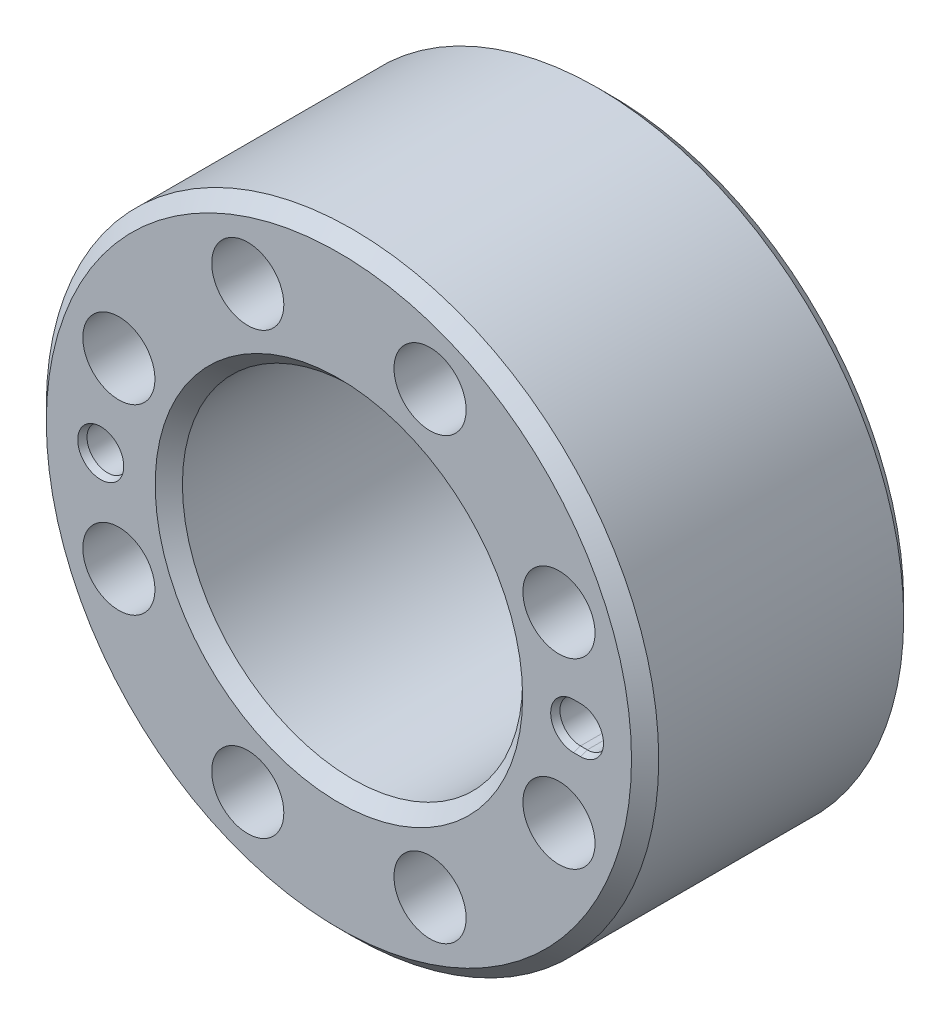
ISO-10303-21;
HEADER;
FILE_DESCRIPTION(('STEP AP214'),'2;1');
FILE_NAME('part.step','',(''),(''),'','','');
FILE_SCHEMA(('AUTOMOTIVE_DESIGN { 1 0 10303 214 1 1 1 1 }'));
ENDSEC;
DATA;
#1=APPLICATION_CONTEXT('core data for automotive mechanical design processes');
#2=APPLICATION_PROTOCOL_DEFINITION('international standard','automotive_design',2000,#1);
#3=PRODUCT_CONTEXT('',#1,'mechanical');
#4=PRODUCT('Part','Part','',(#3));
#5=PRODUCT_RELATED_PRODUCT_CATEGORY('part','',(#4));
#6=PRODUCT_DEFINITION_FORMATION('','',#4);
#7=PRODUCT_DEFINITION_CONTEXT('part definition',#1,'design');
#8=PRODUCT_DEFINITION('design','',#6,#7);
#9=PRODUCT_DEFINITION_SHAPE('','',#8);
#10=(LENGTH_UNIT() NAMED_UNIT(*) SI_UNIT(.MILLI.,.METRE.));
#11=(NAMED_UNIT(*) PLANE_ANGLE_UNIT() SI_UNIT($,.RADIAN.));
#12=(NAMED_UNIT(*) SI_UNIT($,.STERADIAN.) SOLID_ANGLE_UNIT());
#13=UNCERTAINTY_MEASURE_WITH_UNIT(LENGTH_MEASURE(1.E-05),#10,'distance_accuracy_value','');
#14=(GEOMETRIC_REPRESENTATION_CONTEXT(3) GLOBAL_UNCERTAINTY_ASSIGNED_CONTEXT((#13)) GLOBAL_UNIT_ASSIGNED_CONTEXT((#10,
#11,#12)) REPRESENTATION_CONTEXT('',''));
#15=CARTESIAN_POINT('',(0.,0.,0.));
#16=DIRECTION('',(0.,0.,1.));
#17=DIRECTION('',(1.,0.,0.));
#18=AXIS2_PLACEMENT_3D('',#15,#16,#17);
#19=CARTESIAN_POINT('',(0.,0.,10.));
#20=DIRECTION('',(0.,0.,1.));
#21=DIRECTION('',(1.,0.,0.));
#22=AXIS2_PLACEMENT_3D('',#19,#20,#21);
#23=PLANE('',#22);
#24=DIRECTION('',(-1.,0.,0.));
#25=VECTOR('',#24,1.);
#26=CARTESIAN_POINT('',(17.25,-1.68998511713311,10.));
#27=LINE('',#26,#25);
#28=CARTESIAN_POINT('',(17.75,-1.68998511713311,10.));
#29=VERTEX_POINT('',#28);
#30=CARTESIAN_POINT('',(17.25,-1.68998511713311,10.));
#31=VERTEX_POINT('',#30);
#32=EDGE_CURVE('E245',#29,#31,#27,.T.);
#33=ORIENTED_EDGE('',*,*,#32,.T.);
#34=CARTESIAN_POINT('',(17.25,0.,10.));
#35=DIRECTION('',(0.,0.,1.));
#36=DIRECTION('',(1.,0.,0.));
#37=AXIS2_PLACEMENT_3D('',#34,#35,#36);
#38=CIRCLE('',#37,1.68998511713311);
#39=CARTESIAN_POINT('',(17.25,1.68998511713311,10.));
#40=VERTEX_POINT('',#39);
#41=EDGE_CURVE('E247',#31,#40,#38,.F.);
#42=ORIENTED_EDGE('',*,*,#41,.T.);
#43=DIRECTION('',(1.,0.,0.));
#44=VECTOR('',#43,1.);
#45=CARTESIAN_POINT('',(17.75,1.68998511713311,10.));
#46=LINE('',#45,#44);
#47=CARTESIAN_POINT('',(17.75,1.68998511713311,10.));
#48=VERTEX_POINT('',#47);
#49=EDGE_CURVE('E243',#40,#48,#46,.T.);
#50=ORIENTED_EDGE('',*,*,#49,.T.);
#51=CARTESIAN_POINT('',(17.75,0.,10.));
#52=DIRECTION('',(0.,0.,1.));
#53=DIRECTION('',(1.,0.,0.));
#54=AXIS2_PLACEMENT_3D('',#51,#52,#53);
#55=CIRCLE('',#54,1.68998511713311);
#56=EDGE_CURVE('E241',#48,#29,#55,.F.);
#57=ORIENTED_EDGE('',*,*,#56,.T.);
#58=EDGE_LOOP('',(#33,#42,#50,#57));
#59=FACE_BOUND('',#58,.T.);
#60=CARTESIAN_POINT('',(-17.5,0.,10.));
#61=DIRECTION('',(0.,0.,1.));
#62=DIRECTION('',(1.,0.,0.));
#63=AXIS2_PLACEMENT_3D('',#60,#61,#62);
#64=CIRCLE('',#63,1.68998511713309);
#65=CARTESIAN_POINT('',(-15.8100148828669,0.,10.));
#66=VERTEX_POINT('',#65);
#67=EDGE_CURVE('E238',#66,#66,#64,.F.);
#68=ORIENTED_EDGE('',*,*,#67,.T.);
#69=EDGE_LOOP('',(#68));
#70=FACE_BOUND('',#69,.T.);
#71=CARTESIAN_POINT('',(0.,0.,10.));
#72=DIRECTION('',(0.,0.,1.));
#73=DIRECTION('',(1.,0.,0.));
#74=AXIS2_PLACEMENT_3D('',#71,#72,#73);
#75=CIRCLE('',#74,13.5);
#76=CARTESIAN_POINT('',(13.5,0.,10.));
#77=VERTEX_POINT('',#76);
#78=EDGE_CURVE('E216',#77,#77,#75,.F.);
#79=ORIENTED_EDGE('',*,*,#78,.T.);
#80=EDGE_LOOP('',(#79));
#81=FACE_BOUND('',#80,.T.);
#82=CARTESIAN_POINT('',(0.,0.,10.));
#83=DIRECTION('',(0.,0.,1.));
#84=DIRECTION('',(1.,0.,0.));
#85=AXIS2_PLACEMENT_3D('',#82,#83,#84);
#86=CIRCLE('',#85,21.5);
#87=CARTESIAN_POINT('',(21.5,0.,10.));
#88=VERTEX_POINT('',#87);
#89=EDGE_CURVE('E213',#88,#88,#86,.T.);
#90=ORIENTED_EDGE('',*,*,#89,.T.);
#91=EDGE_LOOP('',(#90));
#92=FACE_BOUND('',#91,.T.);
#93=CARTESIAN_POINT('',(6.69696006638907,-16.1678918189475,10.));
#94=DIRECTION('',(0.,0.,1.));
#95=DIRECTION('',(1.,0.,0.));
#96=AXIS2_PLACEMENT_3D('',#93,#94,#95);
#97=CIRCLE('',#96,2.65);
#98=CARTESIAN_POINT('',(9.34696006638907,-16.1678918189475,10.));
#99=VERTEX_POINT('',#98);
#100=EDGE_CURVE('E153',#99,#99,#97,.T.);
#101=ORIENTED_EDGE('',*,*,#100,.F.);
#102=EDGE_LOOP('',(#101));
#103=FACE_BOUND('',#102,.T.);
#104=CARTESIAN_POINT('',(16.1678918189475,-6.69696006638907,10.));
#105=DIRECTION('',(0.,0.,1.));
#106=DIRECTION('',(1.,0.,0.));
#107=AXIS2_PLACEMENT_3D('',#104,#105,#106);
#108=CIRCLE('',#107,2.65);
#109=CARTESIAN_POINT('',(18.8178918189475,-6.69696006638907,10.));
#110=VERTEX_POINT('',#109);
#111=EDGE_CURVE('E159',#110,#110,#108,.T.);
#112=ORIENTED_EDGE('',*,*,#111,.F.);
#113=EDGE_LOOP('',(#112));
#114=FACE_BOUND('',#113,.T.);
#115=CARTESIAN_POINT('',(16.1678918189475,6.69696006638907,10.));
#116=DIRECTION('',(0.,0.,1.));
#117=DIRECTION('',(1.,0.,0.));
#118=AXIS2_PLACEMENT_3D('',#115,#116,#117);
#119=CIRCLE('',#118,2.65);
#120=CARTESIAN_POINT('',(18.8178918189475,6.69696006638907,10.));
#121=VERTEX_POINT('',#120);
#122=EDGE_CURVE('E165',#121,#121,#119,.T.);
#123=ORIENTED_EDGE('',*,*,#122,.F.);
#124=EDGE_LOOP('',(#123));
#125=FACE_BOUND('',#124,.T.);
#126=CARTESIAN_POINT('',(6.69696006638908,16.1678918189475,10.));
#127=DIRECTION('',(0.,0.,1.));
#128=DIRECTION('',(1.,0.,0.));
#129=AXIS2_PLACEMENT_3D('',#126,#127,#128);
#130=CIRCLE('',#129,2.65);
#131=CARTESIAN_POINT('',(9.34696006638907,16.1678918189475,10.));
#132=VERTEX_POINT('',#131);
#133=EDGE_CURVE('E171',#132,#132,#130,.T.);
#134=ORIENTED_EDGE('',*,*,#133,.F.);
#135=EDGE_LOOP('',(#134));
#136=FACE_BOUND('',#135,.T.);
#137=CARTESIAN_POINT('',(-6.69696006638907,16.1678918189475,10.));
#138=DIRECTION('',(0.,0.,1.));
#139=DIRECTION('',(1.,0.,0.));
#140=AXIS2_PLACEMENT_3D('',#137,#138,#139);
#141=CIRCLE('',#140,2.65);
#142=CARTESIAN_POINT('',(-4.04696006638907,16.1678918189475,10.));
#143=VERTEX_POINT('',#142);
#144=EDGE_CURVE('E177',#143,#143,#141,.T.);
#145=ORIENTED_EDGE('',*,*,#144,.F.);
#146=EDGE_LOOP('',(#145));
#147=FACE_BOUND('',#146,.T.);
#148=CARTESIAN_POINT('',(-16.1678918189475,6.69696006638908,10.));
#149=DIRECTION('',(0.,0.,1.));
#150=DIRECTION('',(1.,0.,0.));
#151=AXIS2_PLACEMENT_3D('',#148,#149,#150);
#152=CIRCLE('',#151,2.65);
#153=CARTESIAN_POINT('',(-13.5178918189475,6.69696006638908,10.));
#154=VERTEX_POINT('',#153);
#155=EDGE_CURVE('E183',#154,#154,#152,.T.);
#156=ORIENTED_EDGE('',*,*,#155,.F.);
#157=EDGE_LOOP('',(#156));
#158=FACE_BOUND('',#157,.T.);
#159=CARTESIAN_POINT('',(-16.1678918189475,-6.69696006638907,10.));
#160=DIRECTION('',(0.,0.,1.));
#161=DIRECTION('',(1.,0.,0.));
#162=AXIS2_PLACEMENT_3D('',#159,#160,#161);
#163=CIRCLE('',#162,2.65);
#164=CARTESIAN_POINT('',(-13.5178918189475,-6.69696006638907,10.));
#165=VERTEX_POINT('',#164);
#166=EDGE_CURVE('E189',#165,#165,#163,.T.);
#167=ORIENTED_EDGE('',*,*,#166,.F.);
#168=EDGE_LOOP('',(#167));
#169=FACE_BOUND('',#168,.T.);
#170=CARTESIAN_POINT('',(-6.69696006638908,-16.1678918189475,10.));
#171=DIRECTION('',(0.,0.,1.));
#172=DIRECTION('',(1.,0.,0.));
#173=AXIS2_PLACEMENT_3D('',#170,#171,#172);
#174=CIRCLE('',#173,2.65);
#175=CARTESIAN_POINT('',(-4.04696006638908,-16.1678918189475,10.));
#176=VERTEX_POINT('',#175);
#177=EDGE_CURVE('E195',#176,#176,#174,.T.);
#178=ORIENTED_EDGE('',*,*,#177,.F.);
#179=EDGE_LOOP('',(#178));
#180=FACE_BOUND('',#179,.T.);
#181=ADVANCED_FACE('F44',(#59,#70,#81,#92,#103,#114,#125,#136,#147,#158,#169,#180),#23,.T.);
#182=CARTESIAN_POINT('',(0.,0.,-10.));
#183=DIRECTION('',(0.,0.,1.));
#184=DIRECTION('',(1.,0.,0.));
#185=AXIS2_PLACEMENT_3D('',#182,#183,#184);
#186=PLANE('',#185);
#187=CARTESIAN_POINT('',(17.5,0.,-10.));
#188=DIRECTION('',(0.,0.,1.));
#189=DIRECTION('',(1.,0.,0.));
#190=AXIS2_PLACEMENT_3D('',#187,#188,#189);
#191=CIRCLE('',#190,1.63198511713309);
#192=CARTESIAN_POINT('',(19.1319851171331,0.,-10.));
#193=VERTEX_POINT('',#192);
#194=EDGE_CURVE('E231',#193,#193,#191,.T.);
#195=ORIENTED_EDGE('',*,*,#194,.T.);
#196=EDGE_LOOP('',(#195));
#197=FACE_BOUND('',#196,.T.);
#198=CARTESIAN_POINT('',(-17.5,0.,-10.));
#199=DIRECTION('',(0.,0.,1.));
#200=DIRECTION('',(1.,0.,0.));
#201=AXIS2_PLACEMENT_3D('',#198,#199,#200);
#202=CIRCLE('',#201,1.63198511713309);
#203=CARTESIAN_POINT('',(-15.8680148828669,0.,-10.));
#204=VERTEX_POINT('',#203);
#205=EDGE_CURVE('E228',#204,#204,#202,.T.);
#206=ORIENTED_EDGE('',*,*,#205,.T.);
#207=EDGE_LOOP('',(#206));
#208=FACE_BOUND('',#207,.T.);
#209=CARTESIAN_POINT('',(0.,0.,-10.));
#210=DIRECTION('',(0.,0.,1.));
#211=DIRECTION('',(1.,0.,0.));
#212=AXIS2_PLACEMENT_3D('',#209,#210,#211);
#213=CIRCLE('',#212,13.5);
#214=CARTESIAN_POINT('',(13.5,0.,-10.));
#215=VERTEX_POINT('',#214);
#216=EDGE_CURVE('E204',#215,#215,#213,.T.);
#217=ORIENTED_EDGE('',*,*,#216,.T.);
#218=EDGE_LOOP('',(#217));
#219=FACE_BOUND('',#218,.T.);
#220=CARTESIAN_POINT('',(0.,0.,-10.));
#221=DIRECTION('',(0.,0.,1.));
#222=DIRECTION('',(1.,0.,0.));
#223=AXIS2_PLACEMENT_3D('',#220,#221,#222);
#224=CIRCLE('',#223,21.5);
#225=CARTESIAN_POINT('',(21.5,0.,-10.));
#226=VERTEX_POINT('',#225);
#227=EDGE_CURVE('E201',#226,#226,#224,.F.);
#228=ORIENTED_EDGE('',*,*,#227,.T.);
#229=EDGE_LOOP('',(#228));
#230=FACE_BOUND('',#229,.T.);
#231=CARTESIAN_POINT('',(6.69696006638907,-16.1678918189475,-10.));
#232=DIRECTION('',(0.,0.,1.));
#233=DIRECTION('',(1.,0.,0.));
#234=AXIS2_PLACEMENT_3D('',#231,#232,#233);
#235=CIRCLE('',#234,2.65);
#236=CARTESIAN_POINT('',(9.34696006638906,-16.1678918189475,-10.));
#237=VERTEX_POINT('',#236);
#238=EDGE_CURVE('E156',#237,#237,#235,.T.);
#239=ORIENTED_EDGE('',*,*,#238,.T.);
#240=EDGE_LOOP('',(#239));
#241=FACE_BOUND('',#240,.T.);
#242=CARTESIAN_POINT('',(16.1678918189475,-6.69696006638907,-10.));
#243=DIRECTION('',(0.,0.,1.));
#244=DIRECTION('',(1.,0.,0.));
#245=AXIS2_PLACEMENT_3D('',#242,#243,#244);
#246=CIRCLE('',#245,2.65);
#247=CARTESIAN_POINT('',(18.8178918189475,-6.69696006638907,-10.));
#248=VERTEX_POINT('',#247);
#249=EDGE_CURVE('E162',#248,#248,#246,.T.);
#250=ORIENTED_EDGE('',*,*,#249,.T.);
#251=EDGE_LOOP('',(#250));
#252=FACE_BOUND('',#251,.T.);
#253=CARTESIAN_POINT('',(16.1678918189475,6.69696006638907,-10.));
#254=DIRECTION('',(0.,0.,1.));
#255=DIRECTION('',(1.,0.,0.));
#256=AXIS2_PLACEMENT_3D('',#253,#254,#255);
#257=CIRCLE('',#256,2.65);
#258=CARTESIAN_POINT('',(18.8178918189475,6.69696006638907,-10.));
#259=VERTEX_POINT('',#258);
#260=EDGE_CURVE('E168',#259,#259,#257,.T.);
#261=ORIENTED_EDGE('',*,*,#260,.T.);
#262=EDGE_LOOP('',(#261));
#263=FACE_BOUND('',#262,.T.);
#264=CARTESIAN_POINT('',(6.69696006638908,16.1678918189475,-10.));
#265=DIRECTION('',(0.,0.,1.));
#266=DIRECTION('',(1.,0.,0.));
#267=AXIS2_PLACEMENT_3D('',#264,#265,#266);
#268=CIRCLE('',#267,2.65);
#269=CARTESIAN_POINT('',(9.34696006638907,16.1678918189475,-10.));
#270=VERTEX_POINT('',#269);
#271=EDGE_CURVE('E174',#270,#270,#268,.T.);
#272=ORIENTED_EDGE('',*,*,#271,.T.);
#273=EDGE_LOOP('',(#272));
#274=FACE_BOUND('',#273,.T.);
#275=CARTESIAN_POINT('',(-6.69696006638907,16.1678918189475,-10.));
#276=DIRECTION('',(0.,0.,1.));
#277=DIRECTION('',(1.,0.,0.));
#278=AXIS2_PLACEMENT_3D('',#275,#276,#277);
#279=CIRCLE('',#278,2.65);
#280=CARTESIAN_POINT('',(-4.04696006638907,16.1678918189475,-10.));
#281=VERTEX_POINT('',#280);
#282=EDGE_CURVE('E180',#281,#281,#279,.T.);
#283=ORIENTED_EDGE('',*,*,#282,.T.);
#284=EDGE_LOOP('',(#283));
#285=FACE_BOUND('',#284,.T.);
#286=CARTESIAN_POINT('',(-16.1678918189475,6.69696006638908,-10.));
#287=DIRECTION('',(0.,0.,1.));
#288=DIRECTION('',(1.,0.,0.));
#289=AXIS2_PLACEMENT_3D('',#286,#287,#288);
#290=CIRCLE('',#289,2.65);
#291=CARTESIAN_POINT('',(-13.5178918189475,6.69696006638908,-10.));
#292=VERTEX_POINT('',#291);
#293=EDGE_CURVE('E186',#292,#292,#290,.T.);
#294=ORIENTED_EDGE('',*,*,#293,.T.);
#295=EDGE_LOOP('',(#294));
#296=FACE_BOUND('',#295,.T.);
#297=CARTESIAN_POINT('',(-16.1678918189475,-6.69696006638907,-10.));
#298=DIRECTION('',(0.,0.,1.));
#299=DIRECTION('',(1.,0.,0.));
#300=AXIS2_PLACEMENT_3D('',#297,#298,#299);
#301=CIRCLE('',#300,2.65);
#302=CARTESIAN_POINT('',(-13.5178918189475,-6.69696006638907,-10.));
#303=VERTEX_POINT('',#302);
#304=EDGE_CURVE('E192',#303,#303,#301,.T.);
#305=ORIENTED_EDGE('',*,*,#304,.T.);
#306=EDGE_LOOP('',(#305));
#307=FACE_BOUND('',#306,.T.);
#308=CARTESIAN_POINT('',(-6.69696006638908,-16.1678918189475,-10.));
#309=DIRECTION('',(0.,0.,1.));
#310=DIRECTION('',(1.,0.,0.));
#311=AXIS2_PLACEMENT_3D('',#308,#309,#310);
#312=CIRCLE('',#311,2.65);
#313=CARTESIAN_POINT('',(-4.04696006638908,-16.1678918189475,-10.));
#314=VERTEX_POINT('',#313);
#315=EDGE_CURVE('E198',#314,#314,#312,.T.);
#316=ORIENTED_EDGE('',*,*,#315,.T.);
#317=EDGE_LOOP('',(#316));
#318=FACE_BOUND('',#317,.T.);
#319=ADVANCED_FACE('F284',(#197,#208,#219,#230,#241,#252,#263,#274,#285,#296,#307,#318),#186,.F.);
#320=CARTESIAN_POINT('',(0.,0.,10.));
#321=DIRECTION('',(0.,0.,-1.));
#322=DIRECTION('',(-1.,0.,0.));
#323=AXIS2_PLACEMENT_3D('',#320,#321,#322);
#324=CYLINDRICAL_SURFACE('',#323,22.5);
#325=CARTESIAN_POINT('',(0.,0.,-9.));
#326=DIRECTION('',(0.,0.,1.));
#327=DIRECTION('',(1.,0.,0.));
#328=AXIS2_PLACEMENT_3D('',#325,#326,#327);
#329=CIRCLE('',#328,22.5);
#330=CARTESIAN_POINT('',(22.5,0.,-9.));
#331=VERTEX_POINT('',#330);
#332=EDGE_CURVE('E222',#331,#331,#329,.T.);
#333=ORIENTED_EDGE('',*,*,#332,.T.);
#334=EDGE_LOOP('',(#333));
#335=FACE_BOUND('',#334,.T.);
#336=CARTESIAN_POINT('',(0.,0.,9.00000000000001));
#337=DIRECTION('',(0.,0.,1.));
#338=DIRECTION('',(1.,0.,0.));
#339=AXIS2_PLACEMENT_3D('',#336,#337,#338);
#340=CIRCLE('',#339,22.5);
#341=CARTESIAN_POINT('',(22.5,0.,9.00000000000001));
#342=VERTEX_POINT('',#341);
#343=EDGE_CURVE('E219',#342,#342,#340,.F.);
#344=ORIENTED_EDGE('',*,*,#343,.T.);
#345=EDGE_LOOP('',(#344));
#346=FACE_BOUND('',#345,.T.);
#347=ADVANCED_FACE('F290',(#335,#346),#324,.T.);
#348=CARTESIAN_POINT('',(0.,0.,10.));
#349=DIRECTION('',(0.,0.,-1.));
#350=DIRECTION('',(-1.,0.,0.));
#351=AXIS2_PLACEMENT_3D('',#348,#349,#350);
#352=CYLINDRICAL_SURFACE('',#351,12.5);
#353=CARTESIAN_POINT('',(0.,0.,-8.99999999999999));
#354=DIRECTION('',(0.,0.,1.));
#355=DIRECTION('',(1.,0.,0.));
#356=AXIS2_PLACEMENT_3D('',#353,#354,#355);
#357=CIRCLE('',#356,12.5);
#358=CARTESIAN_POINT('',(12.5,0.,-8.99999999999999));
#359=VERTEX_POINT('',#358);
#360=EDGE_CURVE('E210',#359,#359,#357,.F.);
#361=ORIENTED_EDGE('',*,*,#360,.T.);
#362=EDGE_LOOP('',(#361));
#363=FACE_BOUND('',#362,.T.);
#364=CARTESIAN_POINT('',(0.,0.,8.99999999999999));
#365=DIRECTION('',(0.,0.,1.));
#366=DIRECTION('',(1.,0.,0.));
#367=AXIS2_PLACEMENT_3D('',#364,#365,#366);
#368=CIRCLE('',#367,12.5);
#369=CARTESIAN_POINT('',(12.5,0.,8.99999999999999));
#370=VERTEX_POINT('',#369);
#371=EDGE_CURVE('E207',#370,#370,#368,.T.);
#372=ORIENTED_EDGE('',*,*,#371,.T.);
#373=EDGE_LOOP('',(#372));
#374=FACE_BOUND('',#373,.T.);
#375=ADVANCED_FACE('F295',(#363,#374),#352,.F.);
#376=CARTESIAN_POINT('',(-6.69696006638908,-16.1678918189475,10.));
#377=DIRECTION('',(0.,0.,1.));
#378=DIRECTION('',(1.,0.,0.));
#379=AXIS2_PLACEMENT_3D('',#376,#377,#378);
#380=CYLINDRICAL_SURFACE('',#379,2.65);
#381=ORIENTED_EDGE('',*,*,#315,.F.);
#382=EDGE_LOOP('',(#381));
#383=FACE_BOUND('',#382,.T.);
#384=ORIENTED_EDGE('',*,*,#177,.T.);
#385=EDGE_LOOP('',(#384));
#386=FACE_BOUND('',#385,.T.);
#387=ADVANCED_FACE('F543',(#383,#386),#380,.F.);
#388=CARTESIAN_POINT('',(-16.1678918189475,-6.69696006638907,10.));
#389=DIRECTION('',(0.,0.,1.));
#390=DIRECTION('',(1.,0.,0.));
#391=AXIS2_PLACEMENT_3D('',#388,#389,#390);
#392=CYLINDRICAL_SURFACE('',#391,2.65);
#393=ORIENTED_EDGE('',*,*,#304,.F.);
#394=EDGE_LOOP('',(#393));
#395=FACE_BOUND('',#394,.T.);
#396=ORIENTED_EDGE('',*,*,#166,.T.);
#397=EDGE_LOOP('',(#396));
#398=FACE_BOUND('',#397,.T.);
#399=ADVANCED_FACE('F534',(#395,#398),#392,.F.);
#400=CARTESIAN_POINT('',(-16.1678918189475,6.69696006638908,10.));
#401=DIRECTION('',(0.,0.,1.));
#402=DIRECTION('',(1.,0.,0.));
#403=AXIS2_PLACEMENT_3D('',#400,#401,#402);
#404=CYLINDRICAL_SURFACE('',#403,2.65);
#405=ORIENTED_EDGE('',*,*,#293,.F.);
#406=EDGE_LOOP('',(#405));
#407=FACE_BOUND('',#406,.T.);
#408=ORIENTED_EDGE('',*,*,#155,.T.);
#409=EDGE_LOOP('',(#408));
#410=FACE_BOUND('',#409,.T.);
#411=ADVANCED_FACE('F525',(#407,#410),#404,.F.);
#412=CARTESIAN_POINT('',(-6.69696006638907,16.1678918189475,10.));
#413=DIRECTION('',(0.,0.,1.));
#414=DIRECTION('',(1.,0.,0.));
#415=AXIS2_PLACEMENT_3D('',#412,#413,#414);
#416=CYLINDRICAL_SURFACE('',#415,2.65);
#417=ORIENTED_EDGE('',*,*,#282,.F.);
#418=EDGE_LOOP('',(#417));
#419=FACE_BOUND('',#418,.T.);
#420=ORIENTED_EDGE('',*,*,#144,.T.);
#421=EDGE_LOOP('',(#420));
#422=FACE_BOUND('',#421,.T.);
#423=ADVANCED_FACE('F516',(#419,#422),#416,.F.);
#424=CARTESIAN_POINT('',(6.69696006638908,16.1678918189475,10.));
#425=DIRECTION('',(0.,0.,1.));
#426=DIRECTION('',(1.,0.,0.));
#427=AXIS2_PLACEMENT_3D('',#424,#425,#426);
#428=CYLINDRICAL_SURFACE('',#427,2.65);
#429=ORIENTED_EDGE('',*,*,#271,.F.);
#430=EDGE_LOOP('',(#429));
#431=FACE_BOUND('',#430,.T.);
#432=ORIENTED_EDGE('',*,*,#133,.T.);
#433=EDGE_LOOP('',(#432));
#434=FACE_BOUND('',#433,.T.);
#435=ADVANCED_FACE('F507',(#431,#434),#428,.F.);
#436=CARTESIAN_POINT('',(16.1678918189475,6.69696006638907,10.));
#437=DIRECTION('',(0.,0.,1.));
#438=DIRECTION('',(1.,0.,0.));
#439=AXIS2_PLACEMENT_3D('',#436,#437,#438);
#440=CYLINDRICAL_SURFACE('',#439,2.65);
#441=ORIENTED_EDGE('',*,*,#260,.F.);
#442=EDGE_LOOP('',(#441));
#443=FACE_BOUND('',#442,.T.);
#444=ORIENTED_EDGE('',*,*,#122,.T.);
#445=EDGE_LOOP('',(#444));
#446=FACE_BOUND('',#445,.T.);
#447=ADVANCED_FACE('F498',(#443,#446),#440,.F.);
#448=CARTESIAN_POINT('',(16.1678918189475,-6.69696006638907,10.));
#449=DIRECTION('',(0.,0.,1.));
#450=DIRECTION('',(1.,0.,0.));
#451=AXIS2_PLACEMENT_3D('',#448,#449,#450);
#452=CYLINDRICAL_SURFACE('',#451,2.65);
#453=ORIENTED_EDGE('',*,*,#249,.F.);
#454=EDGE_LOOP('',(#453));
#455=FACE_BOUND('',#454,.T.);
#456=ORIENTED_EDGE('',*,*,#111,.T.);
#457=EDGE_LOOP('',(#456));
#458=FACE_BOUND('',#457,.T.);
#459=ADVANCED_FACE('F489',(#455,#458),#452,.F.);
#460=CARTESIAN_POINT('',(6.69696006638907,-16.1678918189475,10.));
#461=DIRECTION('',(0.,0.,1.));
#462=DIRECTION('',(1.,0.,0.));
#463=AXIS2_PLACEMENT_3D('',#460,#461,#462);
#464=CYLINDRICAL_SURFACE('',#463,2.65);
#465=ORIENTED_EDGE('',*,*,#238,.F.);
#466=EDGE_LOOP('',(#465));
#467=FACE_BOUND('',#466,.T.);
#468=ORIENTED_EDGE('',*,*,#100,.T.);
#469=EDGE_LOOP('',(#468));
#470=FACE_BOUND('',#469,.T.);
#471=ADVANCED_FACE('F480',(#467,#470),#464,.F.);
#472=CARTESIAN_POINT('',(-17.5,0.,5.));
#473=DIRECTION('',(0.,0.,1.));
#474=DIRECTION('',(1.,0.,0.));
#475=AXIS2_PLACEMENT_3D('',#472,#473,#474);
#476=CONICAL_SURFACE('',#475,1.508,1.02974425867665);
#477=CARTESIAN_POINT('',(-17.5,0.,4.09390218650644));
#478=VERTEX_POINT('',#477);
#479=VERTEX_LOOP('',#478);
#480=FACE_BOUND('',#479,.T.);
#481=CARTESIAN_POINT('',(-17.5,0.,5.));
#482=DIRECTION('',(0.,0.,1.));
#483=DIRECTION('',(1.,0.,0.));
#484=AXIS2_PLACEMENT_3D('',#481,#482,#483);
#485=CIRCLE('',#484,1.508);
#486=CARTESIAN_POINT('',(-15.992,0.,5.));
#487=VERTEX_POINT('',#486);
#488=EDGE_CURVE('E150',#487,#487,#485,.T.);
#489=ORIENTED_EDGE('',*,*,#488,.T.);
#490=EDGE_LOOP('',(#489));
#491=FACE_BOUND('',#490,.T.);
#492=ADVANCED_FACE('F471',(#480,#491),#476,.F.);
#493=CARTESIAN_POINT('',(-17.5,0.,10.));
#494=DIRECTION('',(0.,0.,1.));
#495=DIRECTION('',(1.,0.,0.));
#496=AXIS2_PLACEMENT_3D('',#493,#494,#495);
#497=CYLINDRICAL_SURFACE('',#496,1.508);
#498=CARTESIAN_POINT('',(-17.5,0.,9.50000000000003));
#499=DIRECTION('',(0.,0.,1.));
#500=DIRECTION('',(1.,0.,0.));
#501=AXIS2_PLACEMENT_3D('',#498,#499,#500);
#502=CIRCLE('',#501,1.508);
#503=CARTESIAN_POINT('',(-15.992,0.,9.50000000000003));
#504=VERTEX_POINT('',#503);
#505=EDGE_CURVE('E13',#504,#504,#502,.T.);
#506=ORIENTED_EDGE('',*,*,#505,.T.);
#507=EDGE_LOOP('',(#506));
#508=FACE_BOUND('',#507,.T.);
#509=ORIENTED_EDGE('',*,*,#488,.F.);
#510=EDGE_LOOP('',(#509));
#511=FACE_BOUND('',#510,.T.);
#512=ADVANCED_FACE('F462',(#508,#511),#497,.F.);
#513=CARTESIAN_POINT('',(-17.5,0.,-3.));
#514=DIRECTION('',(0.,0.,-1.));
#515=DIRECTION('',(-1.,0.,0.));
#516=AXIS2_PLACEMENT_3D('',#513,#514,#515);
#517=CONICAL_SURFACE('',#516,1.45,1.02974425867665);
#518=CARTESIAN_POINT('',(-17.5,0.,-2.12875210241004));
#519=VERTEX_POINT('',#518);
#520=VERTEX_LOOP('',#519);
#521=FACE_BOUND('',#520,.T.);
#522=CARTESIAN_POINT('',(-17.5,0.,-3.));
#523=DIRECTION('',(0.,0.,-1.));
#524=DIRECTION('',(-1.,0.,0.));
#525=AXIS2_PLACEMENT_3D('',#522,#523,#524);
#526=CIRCLE('',#525,1.45);
#527=CARTESIAN_POINT('',(-18.95,0.,-3.));
#528=VERTEX_POINT('',#527);
#529=EDGE_CURVE('E147',#528,#528,#526,.T.);
#530=ORIENTED_EDGE('',*,*,#529,.T.);
#531=EDGE_LOOP('',(#530));
#532=FACE_BOUND('',#531,.T.);
#533=ADVANCED_FACE('F453',(#521,#532),#517,.F.);
#534=CARTESIAN_POINT('',(-17.5,0.,-10.));
#535=DIRECTION('',(0.,0.,-1.));
#536=DIRECTION('',(-1.,0.,0.));
#537=AXIS2_PLACEMENT_3D('',#534,#535,#536);
#538=CYLINDRICAL_SURFACE('',#537,1.45);
#539=CARTESIAN_POINT('',(-17.5,0.,-9.50000000000001));
#540=DIRECTION('',(0.,0.,1.));
#541=DIRECTION('',(1.,0.,0.));
#542=AXIS2_PLACEMENT_3D('',#539,#540,#541);
#543=CIRCLE('',#542,1.45);
#544=CARTESIAN_POINT('',(-16.05,0.,-9.50000000000001));
#545=VERTEX_POINT('',#544);
#546=EDGE_CURVE('E234',#545,#545,#543,.F.);
#547=ORIENTED_EDGE('',*,*,#546,.T.);
#548=EDGE_LOOP('',(#547));
#549=FACE_BOUND('',#548,.T.);
#550=ORIENTED_EDGE('',*,*,#529,.F.);
#551=EDGE_LOOP('',(#550));
#552=FACE_BOUND('',#551,.T.);
#553=ADVANCED_FACE('F444',(#549,#552),#538,.F.);
#554=CARTESIAN_POINT('',(17.5,0.,-3.));
#555=DIRECTION('',(0.,0.,-1.));
#556=DIRECTION('',(-1.,0.,0.));
#557=AXIS2_PLACEMENT_3D('',#554,#555,#556);
#558=CONICAL_SURFACE('',#557,1.45,1.02974425867665);
#559=CARTESIAN_POINT('',(17.5,0.,-2.12875210241004));
#560=VERTEX_POINT('',#559);
#561=VERTEX_LOOP('',#560);
#562=FACE_BOUND('',#561,.T.);
#563=CARTESIAN_POINT('',(17.5,0.,-3.));
#564=DIRECTION('',(0.,0.,-1.));
#565=DIRECTION('',(-1.,0.,0.));
#566=AXIS2_PLACEMENT_3D('',#563,#564,#565);
#567=CIRCLE('',#566,1.45);
#568=CARTESIAN_POINT('',(16.05,0.,-3.));
#569=VERTEX_POINT('',#568);
#570=EDGE_CURVE('E141',#569,#569,#567,.T.);
#571=ORIENTED_EDGE('',*,*,#570,.T.);
#572=EDGE_LOOP('',(#571));
#573=FACE_BOUND('',#572,.T.);
#574=ADVANCED_FACE('F435',(#562,#573),#558,.F.);
#575=CARTESIAN_POINT('',(17.5,0.,-10.));
#576=DIRECTION('',(0.,0.,-1.));
#577=DIRECTION('',(-1.,0.,0.));
#578=AXIS2_PLACEMENT_3D('',#575,#576,#577);
#579=CYLINDRICAL_SURFACE('',#578,1.45);
#580=CARTESIAN_POINT('',(17.5,0.,-9.50000000000002));
#581=DIRECTION('',(0.,0.,1.));
#582=DIRECTION('',(1.,0.,0.));
#583=AXIS2_PLACEMENT_3D('',#580,#581,#582);
#584=CIRCLE('',#583,1.45);
#585=CARTESIAN_POINT('',(18.95,0.,-9.50000000000002));
#586=VERTEX_POINT('',#585);
#587=EDGE_CURVE('E225',#586,#586,#584,.F.);
#588=ORIENTED_EDGE('',*,*,#587,.T.);
#589=EDGE_LOOP('',(#588));
#590=FACE_BOUND('',#589,.T.);
#591=ORIENTED_EDGE('',*,*,#570,.F.);
#592=EDGE_LOOP('',(#591));
#593=FACE_BOUND('',#592,.T.);
#594=ADVANCED_FACE('F427',(#590,#593),#579,.F.);
#595=CARTESIAN_POINT('',(17.25,0.,4.09390218650644));
#596=DIRECTION('',(0.,0.,1.));
#597=DIRECTION('',(1.,0.,0.));
#598=AXIS2_PLACEMENT_3D('',#595,#596,#597);
#599=CYLINDRICAL_SURFACE('',#598,1.508);
#600=DIRECTION('',(0.,0.,1.));
#601=VECTOR('',#600,1.);
#602=CARTESIAN_POINT('',(17.25,1.508,4.09390218650644));
#603=LINE('',#602,#601);
#604=CARTESIAN_POINT('',(17.25,1.508,4.09390218650644));
#605=VERTEX_POINT('',#604);
#606=CARTESIAN_POINT('',(17.25,1.508,9.49999999999998));
#607=VERTEX_POINT('',#606);
#608=EDGE_CURVE('E139',#605,#607,#603,.T.);
#609=ORIENTED_EDGE('',*,*,#608,.T.);
#610=CARTESIAN_POINT('',(17.25,0.,9.49999999999998));
#611=DIRECTION('',(0.,0.,1.));
#612=DIRECTION('',(1.,0.,0.));
#613=AXIS2_PLACEMENT_3D('',#610,#611,#612);
#614=CIRCLE('',#613,1.508);
#615=CARTESIAN_POINT('',(17.25,-1.508,9.49999999999998));
#616=VERTEX_POINT('',#615);
#617=EDGE_CURVE('E119',#607,#616,#614,.T.);
#618=ORIENTED_EDGE('',*,*,#617,.T.);
#619=DIRECTION('',(0.,0.,1.));
#620=VECTOR('',#619,1.);
#621=CARTESIAN_POINT('',(17.25,-1.508,4.09390218650644));
#622=LINE('',#621,#620);
#623=CARTESIAN_POINT('',(17.25,-1.508,4.09390218650644));
#624=VERTEX_POINT('',#623);
#625=EDGE_CURVE('E111',#624,#616,#622,.T.);
#626=ORIENTED_EDGE('',*,*,#625,.F.);
#627=CARTESIAN_POINT('',(17.25,0.,4.09390218650644));
#628=DIRECTION('',(0.,0.,1.));
#629=DIRECTION('',(1.,0.,0.));
#630=AXIS2_PLACEMENT_3D('',#627,#628,#629);
#631=CIRCLE('',#630,1.508);
#632=EDGE_CURVE('E116',#605,#624,#631,.T.);
#633=ORIENTED_EDGE('',*,*,#632,.F.);
#634=EDGE_LOOP('',(#609,#618,#626,#633));
#635=FACE_BOUND('',#634,.T.);
#636=ADVANCED_FACE('F114',(#635),#599,.F.);
#637=CARTESIAN_POINT('',(17.25,1.508,4.09390218650644));
#638=DIRECTION('',(0.,1.,0.));
#639=DIRECTION('',(0.,0.,1.));
#640=AXIS2_PLACEMENT_3D('',#637,#638,#639);
#641=PLANE('',#640);
#642=DIRECTION('',(0.,0.,1.));
#643=VECTOR('',#642,1.);
#644=CARTESIAN_POINT('',(17.75,1.508,4.09390218650644));
#645=LINE('',#644,#643);
#646=CARTESIAN_POINT('',(17.75,1.508,4.09390218650644));
#647=VERTEX_POINT('',#646);
#648=CARTESIAN_POINT('',(17.75,1.508,9.49999999999998));
#649=VERTEX_POINT('',#648);
#650=EDGE_CURVE('E142',#647,#649,#645,.T.);
#651=ORIENTED_EDGE('',*,*,#650,.T.);
#652=DIRECTION('',(-1.,0.,0.));
#653=VECTOR('',#652,1.);
#654=CARTESIAN_POINT('',(17.25,1.508,9.49999999999998));
#655=LINE('',#654,#653);
#656=EDGE_CURVE('E251',#649,#607,#655,.T.);
#657=ORIENTED_EDGE('',*,*,#656,.T.);
#658=ORIENTED_EDGE('',*,*,#608,.F.);
#659=DIRECTION('',(-1.,0.,0.));
#660=VECTOR('',#659,1.);
#661=CARTESIAN_POINT('',(17.25,1.508,4.09390218650644));
#662=LINE('',#661,#660);
#663=EDGE_CURVE('E121',#647,#605,#662,.T.);
#664=ORIENTED_EDGE('',*,*,#663,.F.);
#665=EDGE_LOOP('',(#651,#657,#658,#664));
#666=FACE_BOUND('',#665,.T.);
#667=ADVANCED_FACE('F273',(#666),#641,.F.);
#668=CARTESIAN_POINT('',(17.75,0.,4.09390218650644));
#669=DIRECTION('',(0.,0.,1.));
#670=DIRECTION('',(1.,0.,0.));
#671=AXIS2_PLACEMENT_3D('',#668,#669,#670);
#672=CYLINDRICAL_SURFACE('',#671,1.508);
#673=DIRECTION('',(0.,0.,1.));
#674=VECTOR('',#673,1.);
#675=CARTESIAN_POINT('',(17.75,-1.508,4.09390218650644));
#676=LINE('',#675,#674);
#677=CARTESIAN_POINT('',(17.75,-1.508,4.09390218650644));
#678=VERTEX_POINT('',#677);
#679=CARTESIAN_POINT('',(17.75,-1.508,9.49999999999998));
#680=VERTEX_POINT('',#679);
#681=EDGE_CURVE('E120',#678,#680,#676,.T.);
#682=ORIENTED_EDGE('',*,*,#681,.T.);
#683=CARTESIAN_POINT('',(17.75,0.,9.49999999999998));
#684=DIRECTION('',(0.,0.,1.));
#685=DIRECTION('',(1.,0.,0.));
#686=AXIS2_PLACEMENT_3D('',#683,#684,#685);
#687=CIRCLE('',#686,1.508);
#688=EDGE_CURVE('E53',#680,#649,#687,.T.);
#689=ORIENTED_EDGE('',*,*,#688,.T.);
#690=ORIENTED_EDGE('',*,*,#650,.F.);
#691=CARTESIAN_POINT('',(17.75,0.,4.09390218650644));
#692=DIRECTION('',(0.,0.,1.));
#693=DIRECTION('',(1.,0.,0.));
#694=AXIS2_PLACEMENT_3D('',#691,#692,#693);
#695=CIRCLE('',#694,1.508);
#696=EDGE_CURVE('E129',#678,#647,#695,.T.);
#697=ORIENTED_EDGE('',*,*,#696,.F.);
#698=EDGE_LOOP('',(#682,#689,#690,#697));
#699=FACE_BOUND('',#698,.T.);
#700=ADVANCED_FACE('F274',(#699),#672,.F.);
#701=CARTESIAN_POINT('',(17.25,-1.508,4.09390218650644));
#702=DIRECTION('',(0.,-1.,0.));
#703=DIRECTION('',(0.,0.,-1.));
#704=AXIS2_PLACEMENT_3D('',#701,#702,#703);
#705=PLANE('',#704);
#706=ORIENTED_EDGE('',*,*,#625,.T.);
#707=DIRECTION('',(1.,0.,0.));
#708=VECTOR('',#707,1.);
#709=CARTESIAN_POINT('',(17.75,-1.508,9.49999999999998));
#710=LINE('',#709,#708);
#711=EDGE_CURVE('E68',#616,#680,#710,.T.);
#712=ORIENTED_EDGE('',*,*,#711,.T.);
#713=ORIENTED_EDGE('',*,*,#681,.F.);
#714=DIRECTION('',(1.,0.,0.));
#715=VECTOR('',#714,1.);
#716=CARTESIAN_POINT('',(17.25,-1.508,4.09390218650644));
#717=LINE('',#716,#715);
#718=EDGE_CURVE('E124',#624,#678,#717,.T.);
#719=ORIENTED_EDGE('',*,*,#718,.F.);
#720=EDGE_LOOP('',(#706,#712,#713,#719));
#721=FACE_BOUND('',#720,.T.);
#722=ADVANCED_FACE('F125',(#721),#705,.F.);
#723=CARTESIAN_POINT('',(17.25,0.,4.09390218650644));
#724=DIRECTION('',(0.,0.,1.));
#725=DIRECTION('',(1.,0.,0.));
#726=AXIS2_PLACEMENT_3D('',#723,#724,#725);
#727=PLANE('',#726);
#728=CARTESIAN_POINT('',(17.5,0.,4.09390218650644));
#729=VERTEX_POINT('',#728);
#730=VERTEX_LOOP('',#729);
#731=FACE_BOUND('',#730,.T.);
#732=ORIENTED_EDGE('',*,*,#632,.T.);
#733=ORIENTED_EDGE('',*,*,#718,.T.);
#734=ORIENTED_EDGE('',*,*,#696,.T.);
#735=ORIENTED_EDGE('',*,*,#663,.T.);
#736=EDGE_LOOP('',(#732,#733,#734,#735));
#737=FACE_BOUND('',#736,.T.);
#738=ADVANCED_FACE('F131',(#731,#737),#727,.T.);
#739=CARTESIAN_POINT('',(0.,0.,-10.));
#740=DIRECTION('',(0.,0.,-1.));
#741=DIRECTION('',(-1.,0.,0.));
#742=AXIS2_PLACEMENT_3D('',#739,#740,#741);
#743=CONICAL_SURFACE('',#742,13.5,0.785398163397448);
#744=ORIENTED_EDGE('',*,*,#360,.F.);
#745=EDGE_LOOP('',(#744));
#746=FACE_BOUND('',#745,.T.);
#747=ORIENTED_EDGE('',*,*,#216,.F.);
#748=EDGE_LOOP('',(#747));
#749=FACE_BOUND('',#748,.T.);
#750=ADVANCED_FACE('F301',(#746,#749),#743,.F.);
#751=CARTESIAN_POINT('',(0.,0.,8.99999999999999));
#752=DIRECTION('',(0.,0.,1.));
#753=DIRECTION('',(1.,0.,0.));
#754=AXIS2_PLACEMENT_3D('',#751,#752,#753);
#755=CONICAL_SURFACE('',#754,12.5,0.785398163397451);
#756=ORIENTED_EDGE('',*,*,#78,.F.);
#757=EDGE_LOOP('',(#756));
#758=FACE_BOUND('',#757,.T.);
#759=ORIENTED_EDGE('',*,*,#371,.F.);
#760=EDGE_LOOP('',(#759));
#761=FACE_BOUND('',#760,.T.);
#762=ADVANCED_FACE('F304',(#758,#761),#755,.F.);
#763=CARTESIAN_POINT('',(0.,0.,-9.));
#764=DIRECTION('',(0.,0.,1.));
#765=DIRECTION('',(1.,0.,0.));
#766=AXIS2_PLACEMENT_3D('',#763,#764,#765);
#767=CONICAL_SURFACE('',#766,22.5,0.785398163397454);
#768=ORIENTED_EDGE('',*,*,#227,.F.);
#769=EDGE_LOOP('',(#768));
#770=FACE_BOUND('',#769,.T.);
#771=ORIENTED_EDGE('',*,*,#332,.F.);
#772=EDGE_LOOP('',(#771));
#773=FACE_BOUND('',#772,.T.);
#774=ADVANCED_FACE('F308',(#770,#773),#767,.T.);
#775=CARTESIAN_POINT('',(0.,0.,10.));
#776=DIRECTION('',(0.,0.,-1.));
#777=DIRECTION('',(-1.,0.,0.));
#778=AXIS2_PLACEMENT_3D('',#775,#776,#777);
#779=CONICAL_SURFACE('',#778,21.5,0.785398163397447);
#780=ORIENTED_EDGE('',*,*,#343,.F.);
#781=EDGE_LOOP('',(#780));
#782=FACE_BOUND('',#781,.T.);
#783=ORIENTED_EDGE('',*,*,#89,.F.);
#784=EDGE_LOOP('',(#783));
#785=FACE_BOUND('',#784,.T.);
#786=ADVANCED_FACE('F312',(#782,#785),#779,.T.);
#787=CARTESIAN_POINT('',(17.5,0.,-9.50000000000002));
#788=DIRECTION('',(0.,0.,-1.));
#789=DIRECTION('',(-1.,0.,0.));
#790=AXIS2_PLACEMENT_3D('',#787,#788,#789);
#791=CONICAL_SURFACE('',#790,1.45,0.349065850398858);
#792=ORIENTED_EDGE('',*,*,#194,.F.);
#793=EDGE_LOOP('',(#792));
#794=FACE_BOUND('',#793,.T.);
#795=ORIENTED_EDGE('',*,*,#587,.F.);
#796=EDGE_LOOP('',(#795));
#797=FACE_BOUND('',#796,.T.);
#798=ADVANCED_FACE('F316',(#794,#797),#791,.F.);
#799=CARTESIAN_POINT('',(-17.5,0.,-9.50000000000001));
#800=DIRECTION('',(0.,0.,-1.));
#801=DIRECTION('',(-1.,0.,0.));
#802=AXIS2_PLACEMENT_3D('',#799,#800,#801);
#803=CONICAL_SURFACE('',#802,1.45,0.349065850398853);
#804=ORIENTED_EDGE('',*,*,#205,.F.);
#805=EDGE_LOOP('',(#804));
#806=FACE_BOUND('',#805,.T.);
#807=ORIENTED_EDGE('',*,*,#546,.F.);
#808=EDGE_LOOP('',(#807));
#809=FACE_BOUND('',#808,.T.);
#810=ADVANCED_FACE('F320',(#806,#809),#803,.F.);
#811=CARTESIAN_POINT('',(17.75,0.,9.49999999999998));
#812=DIRECTION('',(0.,0.,1.));
#813=DIRECTION('',(1.,0.,0.));
#814=AXIS2_PLACEMENT_3D('',#811,#812,#813);
#815=CONICAL_SURFACE('',#814,1.508,0.349065850398862);
#816=DIRECTION('',(0.,0.342020143325665,-0.93969262078591));
#817=VECTOR('',#816,1.);
#818=CARTESIAN_POINT('',(17.75,-1.68998511713311,10.));
#819=LINE('',#818,#817);
#820=EDGE_CURVE('E135',#29,#680,#819,.T.);
#821=ORIENTED_EDGE('',*,*,#820,.F.);
#822=ORIENTED_EDGE('',*,*,#56,.F.);
#823=DIRECTION('',(0.,0.342020143325665,0.93969262078591));
#824=VECTOR('',#823,1.);
#825=CARTESIAN_POINT('',(17.75,1.508,9.49999999999998));
#826=LINE('',#825,#824);
#827=EDGE_CURVE('E48',#649,#48,#826,.T.);
#828=ORIENTED_EDGE('',*,*,#827,.F.);
#829=ORIENTED_EDGE('',*,*,#688,.F.);
#830=EDGE_LOOP('',(#821,#822,#828,#829));
#831=FACE_BOUND('',#830,.T.);
#832=ADVANCED_FACE('F265',(#831),#815,.F.);
#833=CARTESIAN_POINT('',(17.25,1.508,9.49999999999998));
#834=DIRECTION('',(0.,-0.93969262078591,0.342020143325665));
#835=DIRECTION('',(1.,0.,0.));
#836=AXIS2_PLACEMENT_3D('',#833,#834,#835);
#837=PLANE('',#836);
#838=ORIENTED_EDGE('',*,*,#827,.T.);
#839=ORIENTED_EDGE('',*,*,#49,.F.);
#840=DIRECTION('',(0.,0.342020143325665,0.93969262078591));
#841=VECTOR('',#840,1.);
#842=CARTESIAN_POINT('',(17.25,1.508,9.49999999999998));
#843=LINE('',#842,#841);
#844=EDGE_CURVE('E256',#607,#40,#843,.T.);
#845=ORIENTED_EDGE('',*,*,#844,.F.);
#846=ORIENTED_EDGE('',*,*,#656,.F.);
#847=EDGE_LOOP('',(#838,#839,#845,#846));
#848=FACE_BOUND('',#847,.T.);
#849=ADVANCED_FACE('F271',(#848),#837,.T.);
#850=CARTESIAN_POINT('',(17.25,-1.508,9.49999999999998));
#851=DIRECTION('',(0.,0.93969262078591,0.342020143325665));
#852=DIRECTION('',(-1.,0.,0.));
#853=AXIS2_PLACEMENT_3D('',#850,#851,#852);
#854=PLANE('',#853);
#855=ORIENTED_EDGE('',*,*,#820,.T.);
#856=ORIENTED_EDGE('',*,*,#711,.F.);
#857=DIRECTION('',(0.,0.342020143325665,-0.93969262078591));
#858=VECTOR('',#857,1.);
#859=CARTESIAN_POINT('',(17.25,-1.68998511713311,10.));
#860=LINE('',#859,#858);
#861=EDGE_CURVE('E254',#31,#616,#860,.T.);
#862=ORIENTED_EDGE('',*,*,#861,.F.);
#863=ORIENTED_EDGE('',*,*,#32,.F.);
#864=EDGE_LOOP('',(#855,#856,#862,#863));
#865=FACE_BOUND('',#864,.T.);
#866=ADVANCED_FACE('F261',(#865),#854,.T.);
#867=CARTESIAN_POINT('',(17.25,0.,9.49999999999998));
#868=DIRECTION('',(0.,0.,1.));
#869=DIRECTION('',(1.,0.,0.));
#870=AXIS2_PLACEMENT_3D('',#867,#868,#869);
#871=CONICAL_SURFACE('',#870,1.508,0.349065850398862);
#872=ORIENTED_EDGE('',*,*,#844,.T.);
#873=ORIENTED_EDGE('',*,*,#41,.F.);
#874=ORIENTED_EDGE('',*,*,#861,.T.);
#875=ORIENTED_EDGE('',*,*,#617,.F.);
#876=EDGE_LOOP('',(#872,#873,#874,#875));
#877=FACE_BOUND('',#876,.T.);
#878=ADVANCED_FACE('F325',(#877),#871,.F.);
#879=CARTESIAN_POINT('',(-17.5,0.,9.50000000000003));
#880=DIRECTION('',(0.,0.,1.));
#881=DIRECTION('',(1.,0.,0.));
#882=AXIS2_PLACEMENT_3D('',#879,#880,#881);
#883=CONICAL_SURFACE('',#882,1.508,0.349065850398863);
#884=ORIENTED_EDGE('',*,*,#67,.F.);
#885=EDGE_LOOP('',(#884));
#886=FACE_BOUND('',#885,.T.);
#887=ORIENTED_EDGE('',*,*,#505,.F.);
#888=EDGE_LOOP('',(#887));
#889=FACE_BOUND('',#888,.T.);
#890=ADVANCED_FACE('F46',(#886,#889),#883,.F.);
#891=CLOSED_SHELL('',(#181,#319,#347,#375,#387,#399,#411,#423,#435,#447,#459,#471,#492,#512,
#533,#553,#574,#594,#636,#667,#700,#722,#738,#750,#762,#774,#786,#798,#810,#832,#849,#866,#878,#890));
#892=MANIFOLD_SOLID_BREP('B2',#891);
#893=ADVANCED_BREP_SHAPE_REPRESENTATION('',(#18,#892),#14);
#894=SHAPE_DEFINITION_REPRESENTATION(#9,#893);
ENDSEC;
END-ISO-10303-21;
